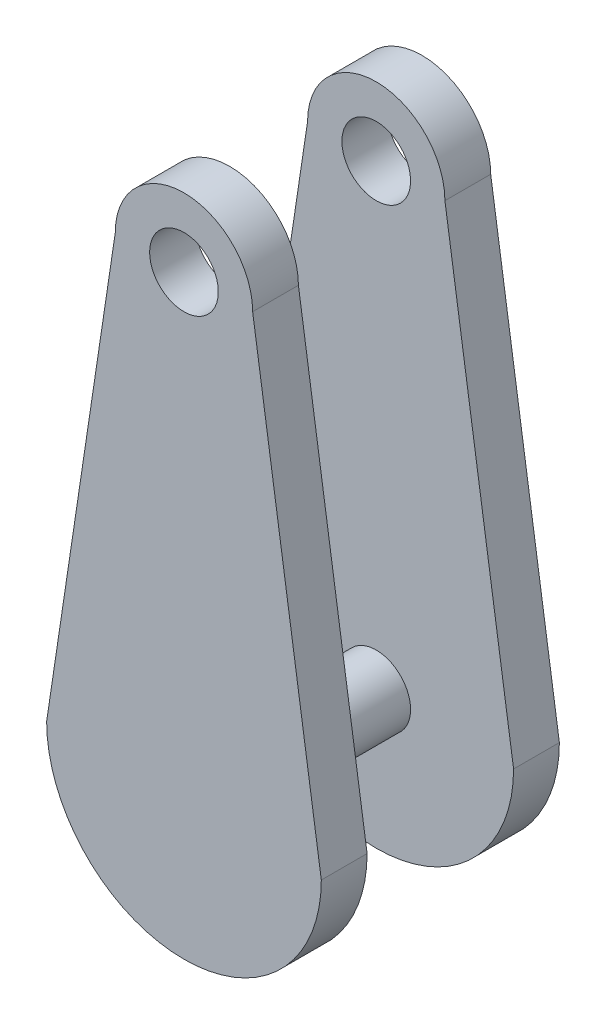
ISO-10303-21;
HEADER;
FILE_DESCRIPTION(('STEP AP214'),'2;1');
FILE_NAME('part.step','',(''),(''),'','','');
FILE_SCHEMA(('AUTOMOTIVE_DESIGN { 1 0 10303 214 1 1 1 1 }'));
ENDSEC;
DATA;
#1=APPLICATION_CONTEXT('core data for automotive mechanical design processes');
#2=APPLICATION_PROTOCOL_DEFINITION('international standard','automotive_design',2000,#1);
#3=PRODUCT_CONTEXT('',#1,'mechanical');
#4=PRODUCT('Part','Part','',(#3));
#5=PRODUCT_RELATED_PRODUCT_CATEGORY('part','',(#4));
#6=PRODUCT_DEFINITION_FORMATION('','',#4);
#7=PRODUCT_DEFINITION_CONTEXT('part definition',#1,'design');
#8=PRODUCT_DEFINITION('design','',#6,#7);
#9=PRODUCT_DEFINITION_SHAPE('','',#8);
#10=(LENGTH_UNIT() NAMED_UNIT(*) SI_UNIT(.MILLI.,.METRE.));
#11=(NAMED_UNIT(*) PLANE_ANGLE_UNIT() SI_UNIT($,.RADIAN.));
#12=(NAMED_UNIT(*) SI_UNIT($,.STERADIAN.) SOLID_ANGLE_UNIT());
#13=UNCERTAINTY_MEASURE_WITH_UNIT(LENGTH_MEASURE(1.E-05),#10,'distance_accuracy_value','');
#14=(GEOMETRIC_REPRESENTATION_CONTEXT(3) GLOBAL_UNCERTAINTY_ASSIGNED_CONTEXT((#13)) GLOBAL_UNIT_ASSIGNED_CONTEXT((#10,
#11,#12)) REPRESENTATION_CONTEXT('',''));
#15=CARTESIAN_POINT('',(0.,0.,0.));
#16=DIRECTION('',(0.,0.,1.));
#17=DIRECTION('',(1.,0.,0.));
#18=AXIS2_PLACEMENT_3D('',#15,#16,#17);
#19=CARTESIAN_POINT('',(0.,0.,-42.));
#20=DIRECTION('',(0.,0.,1.));
#21=DIRECTION('',(1.,0.,0.));
#22=AXIS2_PLACEMENT_3D('',#19,#20,#21);
#23=CYLINDRICAL_SURFACE('',#22,7.5);
#24=CARTESIAN_POINT('',(0.,0.,-2.));
#25=DIRECTION('',(0.,0.,-1.));
#26=DIRECTION('',(-1.,0.,0.));
#27=AXIS2_PLACEMENT_3D('',#24,#25,#26);
#28=CIRCLE('',#27,7.5);
#29=CARTESIAN_POINT('',(7.5,0.,-1.99999999999999));
#30=VERTEX_POINT('',#29);
#31=EDGE_CURVE('E11',#30,#30,#28,.F.);
#32=CARTESIAN_POINT('',(0.,0.,-32.));
#33=DIRECTION('',(0.,0.,1.));
#34=DIRECTION('',(1.,0.,0.));
#35=AXIS2_PLACEMENT_3D('',#32,#33,#34);
#36=CIRCLE('',#35,7.5);
#37=CARTESIAN_POINT('',(7.5,0.,-32.));
#38=VERTEX_POINT('',#37);
#39=EDGE_CURVE('E144',#38,#38,#36,.T.);
#40=CARTESIAN_POINT('',(7.5,0.,-1.99999999999999));
#41=CARTESIAN_POINT('',(7.5,0.,-2.3125));
#42=CARTESIAN_POINT('',(7.5,0.,-2.625));
#43=CARTESIAN_POINT('',(7.5,0.,-3.25));
#44=CARTESIAN_POINT('',(7.5,0.,-3.5625));
#45=CARTESIAN_POINT('',(7.5,0.,-4.1875));
#46=CARTESIAN_POINT('',(7.5,0.,-4.5));
#47=CARTESIAN_POINT('',(7.5,0.,-5.125));
#48=CARTESIAN_POINT('',(7.5,0.,-5.4375));
#49=CARTESIAN_POINT('',(7.5,0.,-6.0625));
#50=CARTESIAN_POINT('',(7.5,0.,-6.375));
#51=CARTESIAN_POINT('',(7.5,0.,-7.));
#52=CARTESIAN_POINT('',(7.5,0.,-7.3125));
#53=CARTESIAN_POINT('',(7.5,0.,-7.9375));
#54=CARTESIAN_POINT('',(7.5,0.,-8.25));
#55=CARTESIAN_POINT('',(7.5,0.,-8.875));
#56=CARTESIAN_POINT('',(7.5,0.,-9.1875));
#57=CARTESIAN_POINT('',(7.5,0.,-9.8125));
#58=CARTESIAN_POINT('',(7.5,0.,-10.125));
#59=CARTESIAN_POINT('',(7.5,0.,-10.75));
#60=CARTESIAN_POINT('',(7.5,0.,-11.0625));
#61=CARTESIAN_POINT('',(7.5,0.,-11.6875));
#62=CARTESIAN_POINT('',(7.5,0.,-12.));
#63=CARTESIAN_POINT('',(7.5,0.,-12.625));
#64=CARTESIAN_POINT('',(7.5,0.,-12.9375));
#65=CARTESIAN_POINT('',(7.5,0.,-13.5625));
#66=CARTESIAN_POINT('',(7.5,0.,-13.875));
#67=CARTESIAN_POINT('',(7.5,0.,-14.5));
#68=CARTESIAN_POINT('',(7.5,0.,-14.8125));
#69=CARTESIAN_POINT('',(7.5,0.,-15.4375));
#70=CARTESIAN_POINT('',(7.5,0.,-15.75));
#71=CARTESIAN_POINT('',(7.5,0.,-16.375));
#72=CARTESIAN_POINT('',(7.5,0.,-16.6875));
#73=CARTESIAN_POINT('',(7.5,0.,-17.3125));
#74=CARTESIAN_POINT('',(7.5,0.,-17.625));
#75=CARTESIAN_POINT('',(7.5,0.,-18.25));
#76=CARTESIAN_POINT('',(7.5,0.,-18.5625));
#77=CARTESIAN_POINT('',(7.5,0.,-19.1875));
#78=CARTESIAN_POINT('',(7.5,0.,-19.5));
#79=CARTESIAN_POINT('',(7.5,0.,-20.125));
#80=CARTESIAN_POINT('',(7.5,0.,-20.4375));
#81=CARTESIAN_POINT('',(7.5,0.,-21.0625));
#82=CARTESIAN_POINT('',(7.5,0.,-21.375));
#83=CARTESIAN_POINT('',(7.5,0.,-22.));
#84=CARTESIAN_POINT('',(7.5,0.,-22.3125));
#85=CARTESIAN_POINT('',(7.5,0.,-22.9375));
#86=CARTESIAN_POINT('',(7.5,0.,-23.25));
#87=CARTESIAN_POINT('',(7.5,0.,-23.875));
#88=CARTESIAN_POINT('',(7.5,0.,-24.1875));
#89=CARTESIAN_POINT('',(7.5,0.,-24.8125));
#90=CARTESIAN_POINT('',(7.5,0.,-25.125));
#91=CARTESIAN_POINT('',(7.5,0.,-25.75));
#92=CARTESIAN_POINT('',(7.5,0.,-26.0625));
#93=CARTESIAN_POINT('',(7.5,0.,-26.6875));
#94=CARTESIAN_POINT('',(7.5,0.,-27.));
#95=CARTESIAN_POINT('',(7.5,0.,-27.625));
#96=CARTESIAN_POINT('',(7.5,0.,-27.9375));
#97=CARTESIAN_POINT('',(7.5,0.,-28.5625));
#98=CARTESIAN_POINT('',(7.5,0.,-28.875));
#99=CARTESIAN_POINT('',(7.5,0.,-29.5));
#100=CARTESIAN_POINT('',(7.5,0.,-29.8125));
#101=CARTESIAN_POINT('',(7.5,0.,-30.4375));
#102=CARTESIAN_POINT('',(7.5,0.,-30.75));
#103=CARTESIAN_POINT('',(7.5,0.,-31.375));
#104=CARTESIAN_POINT('',(7.5,0.,-31.6875));
#105=CARTESIAN_POINT('',(7.5,0.,-32.));
#106=B_SPLINE_CURVE_WITH_KNOTS('',3,(#40,#41,#42,#43,#44,#45,#46,#47,#48,#49,#50,#51,#52,#53,
#54,#55,#56,#57,#58,#59,#60,#61,#62,#63,#64,#65,#66,#67,#68,#69,#70,#71,#72,#73,#74,#75,#76,#77,
#78,#79,#80,#81,#82,#83,#84,#85,#86,#87,#88,#89,#90,#91,#92,#93,#94,#95,#96,#97,#98,#99,#100,
#101,#102,#103,#104,#105),.UNSPECIFIED.,.F.,.F.,(4,2,2,2,2,2,2,2,2,2,2,2,2,2,2,2,2,2,2,2,2,2,2,
2,2,2,2,2,2,2,2,2,4),(0.,0.937500000000001,1.875,2.8125,3.75,4.6875,5.62500000000001,
6.56250000000001,7.50000000000001,8.4375,9.375,10.3125,11.25,12.1875,13.125,14.0625,15.,15.9375,
16.875,17.8125,18.75,19.6875,20.625,21.5625,22.5,23.4375,24.375,25.3125,26.25,27.1875,28.125,
29.0625,30.),.UNSPECIFIED.);
#107=EDGE_CURVE('BSEAM38',#30,#38,#106,.T.);
#108=ORIENTED_EDGE('',*,*,#31,.F.);
#109=ORIENTED_EDGE('',*,*,#39,.T.);
#110=ORIENTED_EDGE('',*,*,#107,.T.);
#111=ORIENTED_EDGE('',*,*,#107,.F.);
#112=EDGE_LOOP('',(#108,#110,#109,#111));
#113=FACE_BOUND('',#112,.T.);
#114=ADVANCED_FACE('F38',(#113),#23,.T.);
#115=CARTESIAN_POINT('',(29.3398533007335,4.40097799511002,-42.));
#116=DIRECTION('',(-0.988936352868298,-0.148340452930245,0.));
#117=DIRECTION('',(0.148340452930245,-0.988936352868298,0.));
#118=AXIS2_PLACEMENT_3D('',#115,#116,#117);
#119=PLANE('',#118);
#120=DIRECTION('',(0.148340452930245,-0.988936352868298,0.));
#121=VECTOR('',#120,1.);
#122=CARTESIAN_POINT('',(29.3398533007335,4.40097799511002,-32.));
#123=LINE('',#122,#121);
#124=CARTESIAN_POINT('',(15.,100.,-32.));
#125=VERTEX_POINT('',#124);
#126=CARTESIAN_POINT('',(30.,0.,-32.));
#127=VERTEX_POINT('',#126);
#128=EDGE_CURVE('E129',#125,#127,#123,.T.);
#129=ORIENTED_EDGE('',*,*,#128,.T.);
#130=DIRECTION('',(0.,0.,1.));
#131=VECTOR('',#130,1.);
#132=CARTESIAN_POINT('',(30.,0.,-42.));
#133=LINE('',#132,#131);
#134=CARTESIAN_POINT('',(30.,0.,-42.));
#135=VERTEX_POINT('',#134);
#136=EDGE_CURVE('E126',#135,#127,#133,.T.);
#137=ORIENTED_EDGE('',*,*,#136,.F.);
#138=DIRECTION('',(0.148340452930245,-0.988936352868298,0.));
#139=VECTOR('',#138,1.);
#140=CARTESIAN_POINT('',(29.3398533007335,4.40097799511002,-42.));
#141=LINE('',#140,#139);
#142=CARTESIAN_POINT('',(15.,100.,-42.));
#143=VERTEX_POINT('',#142);
#144=EDGE_CURVE('E113',#143,#135,#141,.T.);
#145=ORIENTED_EDGE('',*,*,#144,.F.);
#146=DIRECTION('',(0.,0.,1.));
#147=VECTOR('',#146,1.);
#148=CARTESIAN_POINT('',(15.,100.,-42.));
#149=LINE('',#148,#147);
#150=EDGE_CURVE('E143',#143,#125,#149,.T.);
#151=ORIENTED_EDGE('',*,*,#150,.T.);
#152=EDGE_LOOP('',(#129,#137,#145,#151));
#153=FACE_BOUND('',#152,.T.);
#154=ADVANCED_FACE('F127',(#153),#119,.F.);
#155=CARTESIAN_POINT('',(0.,0.,-42.));
#156=DIRECTION('',(0.,0.,1.));
#157=DIRECTION('',(1.,0.,0.));
#158=AXIS2_PLACEMENT_3D('',#155,#156,#157);
#159=CYLINDRICAL_SURFACE('',#158,30.);
#160=CARTESIAN_POINT('',(0.,0.,-32.));
#161=DIRECTION('',(0.,0.,1.));
#162=DIRECTION('',(1.,0.,0.));
#163=AXIS2_PLACEMENT_3D('',#160,#161,#162);
#164=CIRCLE('',#163,30.);
#165=CARTESIAN_POINT('',(-30.,0.,-32.));
#166=VERTEX_POINT('',#165);
#167=EDGE_CURVE('E149',#166,#127,#164,.T.);
#168=ORIENTED_EDGE('',*,*,#167,.F.);
#169=DIRECTION('',(0.,0.,1.));
#170=VECTOR('',#169,1.);
#171=CARTESIAN_POINT('',(-30.,0.,-42.));
#172=LINE('',#171,#170);
#173=CARTESIAN_POINT('',(-30.,0.,-42.));
#174=VERTEX_POINT('',#173);
#175=EDGE_CURVE('E134',#174,#166,#172,.T.);
#176=ORIENTED_EDGE('',*,*,#175,.F.);
#177=CARTESIAN_POINT('',(0.,0.,-42.));
#178=DIRECTION('',(0.,0.,1.));
#179=DIRECTION('',(1.,0.,0.));
#180=AXIS2_PLACEMENT_3D('',#177,#178,#179);
#181=CIRCLE('',#180,30.);
#182=EDGE_CURVE('E118',#174,#135,#181,.T.);
#183=ORIENTED_EDGE('',*,*,#182,.T.);
#184=ORIENTED_EDGE('',*,*,#136,.T.);
#185=EDGE_LOOP('',(#168,#176,#183,#184));
#186=FACE_BOUND('',#185,.T.);
#187=ADVANCED_FACE('F136',(#186),#159,.T.);
#188=CARTESIAN_POINT('',(-29.3398533007335,4.40097799511002,-42.));
#189=DIRECTION('',(-0.988936352868298,0.148340452930245,0.));
#190=DIRECTION('',(-0.148340452930245,-0.988936352868298,0.));
#191=AXIS2_PLACEMENT_3D('',#188,#189,#190);
#192=PLANE('',#191);
#193=DIRECTION('',(-0.148340452930245,-0.988936352868298,0.));
#194=VECTOR('',#193,1.);
#195=CARTESIAN_POINT('',(-29.3398533007335,4.40097799511002,-32.));
#196=LINE('',#195,#194);
#197=CARTESIAN_POINT('',(-15.,100.,-32.));
#198=VERTEX_POINT('',#197);
#199=EDGE_CURVE('E151',#198,#166,#196,.T.);
#200=ORIENTED_EDGE('',*,*,#199,.F.);
#201=DIRECTION('',(0.,0.,1.));
#202=VECTOR('',#201,1.);
#203=CARTESIAN_POINT('',(-15.,100.,-42.));
#204=LINE('',#203,#202);
#205=CARTESIAN_POINT('',(-15.,100.,-42.));
#206=VERTEX_POINT('',#205);
#207=EDGE_CURVE('E157',#206,#198,#204,.T.);
#208=ORIENTED_EDGE('',*,*,#207,.F.);
#209=DIRECTION('',(-0.148340452930245,-0.988936352868298,0.));
#210=VECTOR('',#209,1.);
#211=CARTESIAN_POINT('',(-29.3398533007335,4.40097799511002,-42.));
#212=LINE('',#211,#210);
#213=EDGE_CURVE('E137',#206,#174,#212,.T.);
#214=ORIENTED_EDGE('',*,*,#213,.T.);
#215=ORIENTED_EDGE('',*,*,#175,.T.);
#216=EDGE_LOOP('',(#200,#208,#214,#215));
#217=FACE_BOUND('',#216,.T.);
#218=ADVANCED_FACE('F304',(#217),#192,.T.);
#219=CARTESIAN_POINT('',(0.,100.,-42.));
#220=DIRECTION('',(0.,0.,1.));
#221=DIRECTION('',(1.,0.,0.));
#222=AXIS2_PLACEMENT_3D('',#219,#220,#221);
#223=CYLINDRICAL_SURFACE('',#222,15.);
#224=CARTESIAN_POINT('',(0.,100.,-32.));
#225=DIRECTION('',(0.,0.,1.));
#226=DIRECTION('',(1.,0.,0.));
#227=AXIS2_PLACEMENT_3D('',#224,#225,#226);
#228=CIRCLE('',#227,15.);
#229=EDGE_CURVE('E123',#125,#198,#228,.T.);
#230=ORIENTED_EDGE('',*,*,#229,.F.);
#231=ORIENTED_EDGE('',*,*,#150,.F.);
#232=CARTESIAN_POINT('',(0.,100.,-42.));
#233=DIRECTION('',(0.,0.,1.));
#234=DIRECTION('',(1.,0.,0.));
#235=AXIS2_PLACEMENT_3D('',#232,#233,#234);
#236=CIRCLE('',#235,15.);
#237=EDGE_CURVE('E121',#143,#206,#236,.T.);
#238=ORIENTED_EDGE('',*,*,#237,.T.);
#239=ORIENTED_EDGE('',*,*,#207,.T.);
#240=EDGE_LOOP('',(#230,#231,#238,#239));
#241=FACE_BOUND('',#240,.T.);
#242=ADVANCED_FACE('F312',(#241),#223,.T.);
#243=CARTESIAN_POINT('',(0.,0.,-32.));
#244=DIRECTION('',(0.,0.,-1.));
#245=DIRECTION('',(1.,0.,0.));
#246=AXIS2_PLACEMENT_3D('',#243,#244,#245);
#247=PLANE('',#246);
#248=CARTESIAN_POINT('',(0.,100.,-32.));
#249=DIRECTION('',(0.,0.,-1.));
#250=DIRECTION('',(-1.,0.,0.));
#251=AXIS2_PLACEMENT_3D('',#248,#249,#250);
#252=CIRCLE('',#251,7.5);
#253=CARTESIAN_POINT('',(-7.5,100.,-32.));
#254=VERTEX_POINT('',#253);
#255=EDGE_CURVE('E380',#254,#254,#252,.T.);
#256=ORIENTED_EDGE('',*,*,#255,.T.);
#257=EDGE_LOOP('',(#256));
#258=FACE_BOUND('',#257,.T.);
#259=ORIENTED_EDGE('',*,*,#39,.F.);
#260=EDGE_LOOP('',(#259));
#261=FACE_BOUND('',#260,.T.);
#262=ORIENTED_EDGE('',*,*,#128,.F.);
#263=ORIENTED_EDGE('',*,*,#229,.T.);
#264=ORIENTED_EDGE('',*,*,#199,.T.);
#265=ORIENTED_EDGE('',*,*,#167,.T.);
#266=EDGE_LOOP('',(#262,#263,#264,#265));
#267=FACE_BOUND('',#266,.T.);
#268=ADVANCED_FACE('F283',(#258,#261,#267),#247,.F.);
#269=CARTESIAN_POINT('',(0.,0.,-42.));
#270=DIRECTION('',(0.,0.,1.));
#271=DIRECTION('',(1.,0.,0.));
#272=AXIS2_PLACEMENT_3D('',#269,#270,#271);
#273=PLANE('',#272);
#274=CARTESIAN_POINT('',(0.,100.,-42.));
#275=DIRECTION('',(0.,0.,-1.));
#276=DIRECTION('',(-1.,0.,0.));
#277=AXIS2_PLACEMENT_3D('',#274,#275,#276);
#278=CIRCLE('',#277,7.5);
#279=CARTESIAN_POINT('',(-7.5,100.,-42.));
#280=VERTEX_POINT('',#279);
#281=EDGE_CURVE('E377',#280,#280,#278,.T.);
#282=ORIENTED_EDGE('',*,*,#281,.F.);
#283=EDGE_LOOP('',(#282));
#284=FACE_BOUND('',#283,.T.);
#285=ORIENTED_EDGE('',*,*,#144,.T.);
#286=ORIENTED_EDGE('',*,*,#182,.F.);
#287=ORIENTED_EDGE('',*,*,#213,.F.);
#288=ORIENTED_EDGE('',*,*,#237,.F.);
#289=EDGE_LOOP('',(#285,#286,#287,#288));
#290=FACE_BOUND('',#289,.T.);
#291=ADVANCED_FACE('F115',(#284,#290),#273,.F.);
#292=CARTESIAN_POINT('',(0.,0.,-2.));
#293=DIRECTION('',(0.,0.,-1.));
#294=DIRECTION('',(-1.,0.,0.));
#295=AXIS2_PLACEMENT_3D('',#292,#293,#294);
#296=PLANE('',#295);
#297=CARTESIAN_POINT('',(0.,0.,-2.));
#298=DIRECTION('',(0.,0.,-1.));
#299=DIRECTION('',(-1.,0.,0.));
#300=AXIS2_PLACEMENT_3D('',#297,#298,#299);
#301=CIRCLE('',#300,10.);
#302=CARTESIAN_POINT('',(-10.,0.,-2.));
#303=VERTEX_POINT('',#302);
#304=EDGE_CURVE('E147',#303,#303,#301,.T.);
#305=ORIENTED_EDGE('',*,*,#304,.T.);
#306=EDGE_LOOP('',(#305));
#307=FACE_BOUND('',#306,.T.);
#308=ORIENTED_EDGE('',*,*,#31,.T.);
#309=EDGE_LOOP('',(#308));
#310=FACE_BOUND('',#309,.T.);
#311=ADVANCED_FACE('F224',(#307,#310),#296,.T.);
#312=CARTESIAN_POINT('',(0.,0.,-2.));
#313=DIRECTION('',(0.,0.,1.));
#314=DIRECTION('',(1.,0.,0.));
#315=AXIS2_PLACEMENT_3D('',#312,#313,#314);
#316=CYLINDRICAL_SURFACE('',#315,10.);
#317=ORIENTED_EDGE('',*,*,#304,.F.);
#318=EDGE_LOOP('',(#317));
#319=FACE_BOUND('',#318,.T.);
#320=CARTESIAN_POINT('',(0.,0.,0.));
#321=DIRECTION('',(0.,0.,1.));
#322=DIRECTION('',(1.,0.,0.));
#323=AXIS2_PLACEMENT_3D('',#320,#321,#322);
#324=CIRCLE('',#323,10.);
#325=CARTESIAN_POINT('',(10.,0.,0.));
#326=VERTEX_POINT('',#325);
#327=EDGE_CURVE('E48',#326,#326,#324,.F.);
#328=ORIENTED_EDGE('',*,*,#327,.T.);
#329=EDGE_LOOP('',(#328));
#330=FACE_BOUND('',#329,.T.);
#331=ADVANCED_FACE('F186',(#319,#330),#316,.T.);
#332=CARTESIAN_POINT('',(0.,0.,10.));
#333=DIRECTION('',(0.,0.,1.));
#334=DIRECTION('',(1.,0.,0.));
#335=AXIS2_PLACEMENT_3D('',#332,#333,#334);
#336=PLANE('',#335);
#337=CARTESIAN_POINT('',(0.,100.,10.));
#338=DIRECTION('',(0.,0.,-1.));
#339=DIRECTION('',(-1.,0.,0.));
#340=AXIS2_PLACEMENT_3D('',#337,#338,#339);
#341=CIRCLE('',#340,7.5);
#342=CARTESIAN_POINT('',(-7.5,100.,10.));
#343=VERTEX_POINT('',#342);
#344=EDGE_CURVE('E229',#343,#343,#341,.T.);
#345=ORIENTED_EDGE('',*,*,#344,.T.);
#346=EDGE_LOOP('',(#345));
#347=FACE_BOUND('',#346,.T.);
#348=DIRECTION('',(0.148340452930245,-0.988936352868298,0.));
#349=VECTOR('',#348,1.);
#350=CARTESIAN_POINT('',(29.3398533007335,4.40097799511002,10.));
#351=LINE('',#350,#349);
#352=CARTESIAN_POINT('',(15.,100.,10.));
#353=VERTEX_POINT('',#352);
#354=CARTESIAN_POINT('',(30.,0.,10.));
#355=VERTEX_POINT('',#354);
#356=EDGE_CURVE('E160',#353,#355,#351,.T.);
#357=ORIENTED_EDGE('',*,*,#356,.F.);
#358=CARTESIAN_POINT('',(0.,100.,10.));
#359=DIRECTION('',(0.,0.,1.));
#360=DIRECTION('',(1.,0.,0.));
#361=AXIS2_PLACEMENT_3D('',#358,#359,#360);
#362=CIRCLE('',#361,15.);
#363=CARTESIAN_POINT('',(-15.,100.,10.));
#364=VERTEX_POINT('',#363);
#365=EDGE_CURVE('E162',#353,#364,#362,.T.);
#366=ORIENTED_EDGE('',*,*,#365,.T.);
#367=DIRECTION('',(-0.148340452930245,-0.988936352868298,0.));
#368=VECTOR('',#367,1.);
#369=CARTESIAN_POINT('',(-29.3398533007335,4.40097799511002,10.));
#370=LINE('',#369,#368);
#371=CARTESIAN_POINT('',(-30.,0.,10.));
#372=VERTEX_POINT('',#371);
#373=EDGE_CURVE('E165',#364,#372,#370,.T.);
#374=ORIENTED_EDGE('',*,*,#373,.T.);
#375=CARTESIAN_POINT('',(0.,0.,10.));
#376=DIRECTION('',(0.,0.,1.));
#377=DIRECTION('',(1.,0.,0.));
#378=AXIS2_PLACEMENT_3D('',#375,#376,#377);
#379=CIRCLE('',#378,30.);
#380=EDGE_CURVE('E56',#372,#355,#379,.T.);
#381=ORIENTED_EDGE('',*,*,#380,.T.);
#382=EDGE_LOOP('',(#357,#366,#374,#381));
#383=FACE_BOUND('',#382,.T.);
#384=ADVANCED_FACE('F214',(#347,#383),#336,.T.);
#385=CARTESIAN_POINT('',(0.,100.,10.));
#386=DIRECTION('',(0.,0.,-1.));
#387=DIRECTION('',(-1.,0.,0.));
#388=AXIS2_PLACEMENT_3D('',#385,#386,#387);
#389=CYLINDRICAL_SURFACE('',#388,15.);
#390=CARTESIAN_POINT('',(0.,100.,0.));
#391=DIRECTION('',(0.,0.,1.));
#392=DIRECTION('',(1.,0.,0.));
#393=AXIS2_PLACEMENT_3D('',#390,#391,#392);
#394=CIRCLE('',#393,15.);
#395=CARTESIAN_POINT('',(15.,100.,0.));
#396=VERTEX_POINT('',#395);
#397=CARTESIAN_POINT('',(-15.,100.,0.));
#398=VERTEX_POINT('',#397);
#399=EDGE_CURVE('E169',#396,#398,#394,.T.);
#400=ORIENTED_EDGE('',*,*,#399,.T.);
#401=DIRECTION('',(0.,0.,-1.));
#402=VECTOR('',#401,1.);
#403=CARTESIAN_POINT('',(-15.,100.,10.));
#404=LINE('',#403,#402);
#405=EDGE_CURVE('E179',#364,#398,#404,.T.);
#406=ORIENTED_EDGE('',*,*,#405,.F.);
#407=ORIENTED_EDGE('',*,*,#365,.F.);
#408=DIRECTION('',(0.,0.,-1.));
#409=VECTOR('',#408,1.);
#410=CARTESIAN_POINT('',(15.,100.,10.));
#411=LINE('',#410,#409);
#412=EDGE_CURVE('E83',#353,#396,#411,.T.);
#413=ORIENTED_EDGE('',*,*,#412,.T.);
#414=EDGE_LOOP('',(#400,#406,#407,#413));
#415=FACE_BOUND('',#414,.T.);
#416=ADVANCED_FACE('F216',(#415),#389,.T.);
#417=CARTESIAN_POINT('',(-29.3398533007335,4.40097799511002,10.));
#418=DIRECTION('',(0.988936352868298,-0.148340452930245,0.));
#419=DIRECTION('',(0.148340452930245,0.988936352868298,0.));
#420=AXIS2_PLACEMENT_3D('',#417,#418,#419);
#421=PLANE('',#420);
#422=DIRECTION('',(-0.148340452930245,-0.988936352868298,0.));
#423=VECTOR('',#422,1.);
#424=CARTESIAN_POINT('',(-29.3398533007335,4.40097799511002,0.));
#425=LINE('',#424,#423);
#426=CARTESIAN_POINT('',(-30.,0.,0.));
#427=VERTEX_POINT('',#426);
#428=EDGE_CURVE('E172',#398,#427,#425,.T.);
#429=ORIENTED_EDGE('',*,*,#428,.T.);
#430=DIRECTION('',(0.,0.,-1.));
#431=VECTOR('',#430,1.);
#432=CARTESIAN_POINT('',(-30.,0.,10.));
#433=LINE('',#432,#431);
#434=EDGE_CURVE('E177',#372,#427,#433,.T.);
#435=ORIENTED_EDGE('',*,*,#434,.F.);
#436=ORIENTED_EDGE('',*,*,#373,.F.);
#437=ORIENTED_EDGE('',*,*,#405,.T.);
#438=EDGE_LOOP('',(#429,#435,#436,#437));
#439=FACE_BOUND('',#438,.T.);
#440=ADVANCED_FACE('F222',(#439),#421,.F.);
#441=CARTESIAN_POINT('',(0.,0.,10.));
#442=DIRECTION('',(0.,0.,-1.));
#443=DIRECTION('',(-1.,0.,0.));
#444=AXIS2_PLACEMENT_3D('',#441,#442,#443);
#445=CYLINDRICAL_SURFACE('',#444,30.);
#446=CARTESIAN_POINT('',(0.,0.,0.));
#447=DIRECTION('',(0.,0.,1.));
#448=DIRECTION('',(1.,0.,0.));
#449=AXIS2_PLACEMENT_3D('',#446,#447,#448);
#450=CIRCLE('',#449,30.);
#451=CARTESIAN_POINT('',(30.,0.,0.));
#452=VERTEX_POINT('',#451);
#453=EDGE_CURVE('E73',#427,#452,#450,.T.);
#454=ORIENTED_EDGE('',*,*,#453,.T.);
#455=DIRECTION('',(0.,0.,-1.));
#456=VECTOR('',#455,1.);
#457=CARTESIAN_POINT('',(30.,0.,10.));
#458=LINE('',#457,#456);
#459=EDGE_CURVE('E80',#355,#452,#458,.T.);
#460=ORIENTED_EDGE('',*,*,#459,.F.);
#461=ORIENTED_EDGE('',*,*,#380,.F.);
#462=ORIENTED_EDGE('',*,*,#434,.T.);
#463=EDGE_LOOP('',(#454,#460,#461,#462));
#464=FACE_BOUND('',#463,.T.);
#465=ADVANCED_FACE('F200',(#464),#445,.T.);
#466=CARTESIAN_POINT('',(29.3398533007335,4.40097799511002,10.));
#467=DIRECTION('',(0.988936352868298,0.148340452930245,0.));
#468=DIRECTION('',(-0.148340452930245,0.988936352868298,0.));
#469=AXIS2_PLACEMENT_3D('',#466,#467,#468);
#470=PLANE('',#469);
#471=DIRECTION('',(0.148340452930245,-0.988936352868298,0.));
#472=VECTOR('',#471,1.);
#473=CARTESIAN_POINT('',(29.3398533007335,4.40097799511002,0.));
#474=LINE('',#473,#472);
#475=EDGE_CURVE('E133',#396,#452,#474,.T.);
#476=ORIENTED_EDGE('',*,*,#475,.F.);
#477=ORIENTED_EDGE('',*,*,#412,.F.);
#478=ORIENTED_EDGE('',*,*,#356,.T.);
#479=ORIENTED_EDGE('',*,*,#459,.T.);
#480=EDGE_LOOP('',(#476,#477,#478,#479));
#481=FACE_BOUND('',#480,.T.);
#482=ADVANCED_FACE('F40',(#481),#470,.T.);
#483=CARTESIAN_POINT('',(0.,0.,0.));
#484=DIRECTION('',(0.,0.,1.));
#485=DIRECTION('',(1.,0.,0.));
#486=AXIS2_PLACEMENT_3D('',#483,#484,#485);
#487=PLANE('',#486);
#488=CARTESIAN_POINT('',(0.,100.,0.));
#489=DIRECTION('',(0.,0.,1.));
#490=DIRECTION('',(1.,0.,0.));
#491=AXIS2_PLACEMENT_3D('',#488,#489,#490);
#492=CIRCLE('',#491,7.5);
#493=CARTESIAN_POINT('',(-7.5,100.,0.));
#494=VERTEX_POINT('',#493);
#495=EDGE_CURVE('E42',#494,#494,#492,.T.);
#496=ORIENTED_EDGE('',*,*,#495,.T.);
#497=EDGE_LOOP('',(#496));
#498=FACE_BOUND('',#497,.T.);
#499=ORIENTED_EDGE('',*,*,#475,.T.);
#500=ORIENTED_EDGE('',*,*,#453,.F.);
#501=ORIENTED_EDGE('',*,*,#428,.F.);
#502=ORIENTED_EDGE('',*,*,#399,.F.);
#503=EDGE_LOOP('',(#499,#500,#501,#502));
#504=FACE_BOUND('',#503,.T.);
#505=ORIENTED_EDGE('',*,*,#327,.F.);
#506=EDGE_LOOP('',(#505));
#507=FACE_BOUND('',#506,.T.);
#508=ADVANCED_FACE('F188',(#498,#504,#507),#487,.F.);
#509=CARTESIAN_POINT('',(0.,100.,10.));
#510=DIRECTION('',(0.,0.,-1.));
#511=DIRECTION('',(-1.,0.,0.));
#512=AXIS2_PLACEMENT_3D('',#509,#510,#511);
#513=CYLINDRICAL_SURFACE('',#512,7.5);
#514=CARTESIAN_POINT('',(-7.5,100.,10.));
#515=CARTESIAN_POINT('',(-7.5,100.,9.89583333333334));
#516=CARTESIAN_POINT('',(-7.5,100.,9.79166666666667));
#517=CARTESIAN_POINT('',(-7.5,100.,9.58333333333334));
#518=CARTESIAN_POINT('',(-7.5,100.,9.47916666666667));
#519=CARTESIAN_POINT('',(-7.5,100.,9.27083333333334));
#520=CARTESIAN_POINT('',(-7.5,100.,9.16666666666667));
#521=CARTESIAN_POINT('',(-7.5,100.,8.95833333333334));
#522=CARTESIAN_POINT('',(-7.5,100.,8.85416666666667));
#523=CARTESIAN_POINT('',(-7.5,100.,8.64583333333334));
#524=CARTESIAN_POINT('',(-7.5,100.,8.54166666666667));
#525=CARTESIAN_POINT('',(-7.5,100.,8.33333333333334));
#526=CARTESIAN_POINT('',(-7.5,100.,8.22916666666667));
#527=CARTESIAN_POINT('',(-7.5,100.,8.02083333333333));
#528=CARTESIAN_POINT('',(-7.5,100.,7.91666666666667));
#529=CARTESIAN_POINT('',(-7.5,100.,7.70833333333334));
#530=CARTESIAN_POINT('',(-7.5,100.,7.60416666666667));
#531=CARTESIAN_POINT('',(-7.5,100.,7.39583333333333));
#532=CARTESIAN_POINT('',(-7.5,100.,7.29166666666667));
#533=CARTESIAN_POINT('',(-7.5,100.,7.08333333333333));
#534=CARTESIAN_POINT('',(-7.5,100.,6.97916666666667));
#535=CARTESIAN_POINT('',(-7.5,100.,6.77083333333333));
#536=CARTESIAN_POINT('',(-7.5,100.,6.66666666666667));
#537=CARTESIAN_POINT('',(-7.5,100.,6.45833333333333));
#538=CARTESIAN_POINT('',(-7.5,100.,6.35416666666667));
#539=CARTESIAN_POINT('',(-7.5,100.,6.14583333333333));
#540=CARTESIAN_POINT('',(-7.5,100.,6.04166666666667));
#541=CARTESIAN_POINT('',(-7.5,100.,5.83333333333334));
#542=CARTESIAN_POINT('',(-7.5,100.,5.72916666666667));
#543=CARTESIAN_POINT('',(-7.5,100.,5.52083333333333));
#544=CARTESIAN_POINT('',(-7.5,100.,5.41666666666667));
#545=CARTESIAN_POINT('',(-7.5,100.,5.20833333333333));
#546=CARTESIAN_POINT('',(-7.5,100.,5.10416666666667));
#547=CARTESIAN_POINT('',(-7.5,100.,4.89583333333333));
#548=CARTESIAN_POINT('',(-7.5,100.,4.79166666666667));
#549=CARTESIAN_POINT('',(-7.5,100.,4.58333333333333));
#550=CARTESIAN_POINT('',(-7.5,100.,4.47916666666667));
#551=CARTESIAN_POINT('',(-7.5,100.,4.27083333333333));
#552=CARTESIAN_POINT('',(-7.5,100.,4.16666666666667));
#553=CARTESIAN_POINT('',(-7.5,100.,3.95833333333333));
#554=CARTESIAN_POINT('',(-7.5,100.,3.85416666666667));
#555=CARTESIAN_POINT('',(-7.5,100.,3.64583333333333));
#556=CARTESIAN_POINT('',(-7.5,100.,3.54166666666667));
#557=CARTESIAN_POINT('',(-7.5,100.,3.33333333333333));
#558=CARTESIAN_POINT('',(-7.5,100.,3.22916666666667));
#559=CARTESIAN_POINT('',(-7.5,100.,3.02083333333333));
#560=CARTESIAN_POINT('',(-7.5,100.,2.91666666666667));
#561=CARTESIAN_POINT('',(-7.5,100.,2.70833333333333));
#562=CARTESIAN_POINT('',(-7.5,100.,2.60416666666667));
#563=CARTESIAN_POINT('',(-7.5,100.,2.39583333333333));
#564=CARTESIAN_POINT('',(-7.5,100.,2.29166666666667));
#565=CARTESIAN_POINT('',(-7.5,100.,2.08333333333333));
#566=CARTESIAN_POINT('',(-7.5,100.,1.97916666666667));
#567=CARTESIAN_POINT('',(-7.5,100.,1.77083333333333));
#568=CARTESIAN_POINT('',(-7.5,100.,1.66666666666667));
#569=CARTESIAN_POINT('',(-7.5,100.,1.45833333333333));
#570=CARTESIAN_POINT('',(-7.5,100.,1.35416666666667));
#571=CARTESIAN_POINT('',(-7.5,100.,1.14583333333333));
#572=CARTESIAN_POINT('',(-7.5,100.,1.04166666666667));
#573=CARTESIAN_POINT('',(-7.5,100.,0.833333333333332));
#574=CARTESIAN_POINT('',(-7.5,100.,0.729166666666666));
#575=CARTESIAN_POINT('',(-7.5,100.,0.520833333333332));
#576=CARTESIAN_POINT('',(-7.5,100.,0.416666666666665));
#577=CARTESIAN_POINT('',(-7.5,100.,0.208333333333332));
#578=CARTESIAN_POINT('',(-7.5,100.,0.104166666666665));
#579=CARTESIAN_POINT('',(-7.5,100.,0.));
#580=B_SPLINE_CURVE_WITH_KNOTS('',3,(#514,#515,#516,#517,#518,#519,#520,#521,#522,#523,#524,
#525,#526,#527,#528,#529,#530,#531,#532,#533,#534,#535,#536,#537,#538,#539,#540,#541,#542,#543,
#544,#545,#546,#547,#548,#549,#550,#551,#552,#553,#554,#555,#556,#557,#558,#559,#560,#561,#562,
#563,#564,#565,#566,#567,#568,#569,#570,#571,#572,#573,#574,#575,#576,#577,#578,#579),
.UNSPECIFIED.,.F.,.F.,(4,2,2,2,2,2,2,2,2,2,2,2,2,2,2,2,2,2,2,2,2,2,2,2,2,2,2,2,2,2,2,2,4),(0.,
0.312499999999999,0.624999999999999,0.937499999999999,1.25,1.5625,1.875,2.1875,2.5,2.8125,3.125,
3.4375,3.75,4.0625,4.375,4.6875,5.,5.3125,5.625,5.9375,6.25,6.5625,6.875,7.1875,7.5,7.8125,
8.125,8.4375,8.75,9.0625,9.375,9.6875,10.),.UNSPECIFIED.);
#581=EDGE_CURVE('BSEAM190',#343,#494,#580,.T.);
#582=ORIENTED_EDGE('',*,*,#344,.F.);
#583=ORIENTED_EDGE('',*,*,#495,.F.);
#584=ORIENTED_EDGE('',*,*,#581,.T.);
#585=ORIENTED_EDGE('',*,*,#581,.F.);
#586=EDGE_LOOP('',(#582,#584,#583,#585));
#587=FACE_BOUND('',#586,.T.);
#588=ADVANCED_FACE('F190',(#587),#513,.F.);
#589=CARTESIAN_POINT('',(-7.5,100.,-42.));
#590=CARTESIAN_POINT('',(-7.5,100.,-41.8958333333333));
#591=CARTESIAN_POINT('',(-7.5,100.,-41.7916666666667));
#592=CARTESIAN_POINT('',(-7.5,100.,-41.5833333333333));
#593=CARTESIAN_POINT('',(-7.5,100.,-41.4791666666667));
#594=CARTESIAN_POINT('',(-7.5,100.,-41.2708333333333));
#595=CARTESIAN_POINT('',(-7.5,100.,-41.1666666666667));
#596=CARTESIAN_POINT('',(-7.5,100.,-40.9583333333333));
#597=CARTESIAN_POINT('',(-7.5,100.,-40.8541666666667));
#598=CARTESIAN_POINT('',(-7.5,100.,-40.6458333333333));
#599=CARTESIAN_POINT('',(-7.5,100.,-40.5416666666667));
#600=CARTESIAN_POINT('',(-7.5,100.,-40.3333333333333));
#601=CARTESIAN_POINT('',(-7.5,100.,-40.2291666666667));
#602=CARTESIAN_POINT('',(-7.5,100.,-40.0208333333333));
#603=CARTESIAN_POINT('',(-7.5,100.,-39.9166666666667));
#604=CARTESIAN_POINT('',(-7.5,100.,-39.7083333333333));
#605=CARTESIAN_POINT('',(-7.5,100.,-39.6041666666667));
#606=CARTESIAN_POINT('',(-7.5,100.,-39.3958333333333));
#607=CARTESIAN_POINT('',(-7.5,100.,-39.2916666666667));
#608=CARTESIAN_POINT('',(-7.5,100.,-39.0833333333333));
#609=CARTESIAN_POINT('',(-7.5,100.,-38.9791666666667));
#610=CARTESIAN_POINT('',(-7.5,100.,-38.7708333333333));
#611=CARTESIAN_POINT('',(-7.5,100.,-38.6666666666667));
#612=CARTESIAN_POINT('',(-7.5,100.,-38.4583333333333));
#613=CARTESIAN_POINT('',(-7.5,100.,-38.3541666666667));
#614=CARTESIAN_POINT('',(-7.5,100.,-38.1458333333333));
#615=CARTESIAN_POINT('',(-7.5,100.,-38.0416666666667));
#616=CARTESIAN_POINT('',(-7.5,100.,-37.8333333333333));
#617=CARTESIAN_POINT('',(-7.5,100.,-37.7291666666667));
#618=CARTESIAN_POINT('',(-7.5,100.,-37.5208333333333));
#619=CARTESIAN_POINT('',(-7.5,100.,-37.4166666666667));
#620=CARTESIAN_POINT('',(-7.5,100.,-37.2083333333333));
#621=CARTESIAN_POINT('',(-7.5,100.,-37.1041666666667));
#622=CARTESIAN_POINT('',(-7.5,100.,-36.8958333333333));
#623=CARTESIAN_POINT('',(-7.5,100.,-36.7916666666667));
#624=CARTESIAN_POINT('',(-7.5,100.,-36.5833333333333));
#625=CARTESIAN_POINT('',(-7.5,100.,-36.4791666666667));
#626=CARTESIAN_POINT('',(-7.5,100.,-36.2708333333333));
#627=CARTESIAN_POINT('',(-7.5,100.,-36.1666666666667));
#628=CARTESIAN_POINT('',(-7.5,100.,-35.9583333333333));
#629=CARTESIAN_POINT('',(-7.5,100.,-35.8541666666667));
#630=CARTESIAN_POINT('',(-7.5,100.,-35.6458333333333));
#631=CARTESIAN_POINT('',(-7.5,100.,-35.5416666666667));
#632=CARTESIAN_POINT('',(-7.5,100.,-35.3333333333333));
#633=CARTESIAN_POINT('',(-7.5,100.,-35.2291666666667));
#634=CARTESIAN_POINT('',(-7.5,100.,-35.0208333333333));
#635=CARTESIAN_POINT('',(-7.5,100.,-34.9166666666667));
#636=CARTESIAN_POINT('',(-7.5,100.,-34.7083333333333));
#637=CARTESIAN_POINT('',(-7.5,100.,-34.6041666666667));
#638=CARTESIAN_POINT('',(-7.5,100.,-34.3958333333333));
#639=CARTESIAN_POINT('',(-7.5,100.,-34.2916666666667));
#640=CARTESIAN_POINT('',(-7.5,100.,-34.0833333333333));
#641=CARTESIAN_POINT('',(-7.5,100.,-33.9791666666667));
#642=CARTESIAN_POINT('',(-7.5,100.,-33.7708333333333));
#643=CARTESIAN_POINT('',(-7.5,100.,-33.6666666666667));
#644=CARTESIAN_POINT('',(-7.5,100.,-33.4583333333333));
#645=CARTESIAN_POINT('',(-7.5,100.,-33.3541666666667));
#646=CARTESIAN_POINT('',(-7.5,100.,-33.1458333333333));
#647=CARTESIAN_POINT('',(-7.5,100.,-33.0416666666667));
#648=CARTESIAN_POINT('',(-7.5,100.,-32.8333333333333));
#649=CARTESIAN_POINT('',(-7.5,100.,-32.7291666666667));
#650=CARTESIAN_POINT('',(-7.5,100.,-32.5208333333333));
#651=CARTESIAN_POINT('',(-7.5,100.,-32.4166666666667));
#652=CARTESIAN_POINT('',(-7.5,100.,-32.2083333333333));
#653=CARTESIAN_POINT('',(-7.5,100.,-32.1041666666667));
#654=CARTESIAN_POINT('',(-7.5,100.,-32.));
#655=B_SPLINE_CURVE_WITH_KNOTS('',3,(#589,#590,#591,#592,#593,#594,#595,#596,#597,#598,#599,
#600,#601,#602,#603,#604,#605,#606,#607,#608,#609,#610,#611,#612,#613,#614,#615,#616,#617,#618,
#619,#620,#621,#622,#623,#624,#625,#626,#627,#628,#629,#630,#631,#632,#633,#634,#635,#636,#637,
#638,#639,#640,#641,#642,#643,#644,#645,#646,#647,#648,#649,#650,#651,#652,#653,#654),
.UNSPECIFIED.,.F.,.F.,(4,2,2,2,2,2,2,2,2,2,2,2,2,2,2,2,2,2,2,2,2,2,2,2,2,2,2,2,2,2,2,2,4),(0.,
0.3125,0.625000000000001,0.937500000000001,1.25,1.5625,1.875,2.1875,2.5,2.8125,3.125,3.4375,
3.75,4.0625,4.375,4.6875,5.,5.3125,5.625,5.9375,6.25,6.5625,6.875,7.1875,7.49999999999999,
7.8125,8.12499999999999,8.43749999999999,8.74999999999999,9.06249999999999,9.37499999999999,
9.68749999999999,9.99999999999999),.UNSPECIFIED.);
#656=EDGE_CURVE('BSEAM197',#280,#254,#655,.T.);
#657=ORIENTED_EDGE('',*,*,#281,.T.);
#658=ORIENTED_EDGE('',*,*,#255,.F.);
#659=ORIENTED_EDGE('',*,*,#656,.T.);
#660=ORIENTED_EDGE('',*,*,#656,.F.);
#661=EDGE_LOOP('',(#657,#659,#658,#660));
#662=FACE_BOUND('',#661,.T.);
#663=ADVANCED_FACE('F197',(#662),#513,.F.);
#664=CLOSED_SHELL('',(#114,#154,#187,#218,#242,#268,#291,#311,#331,#384,#416,#440,#465,#482,
#508,#588,#663));
#665=MANIFOLD_SOLID_BREP('B2',#664);
#666=ADVANCED_BREP_SHAPE_REPRESENTATION('',(#18,#665),#14);
#667=SHAPE_DEFINITION_REPRESENTATION(#9,#666);
ENDSEC;
END-ISO-10303-21;
